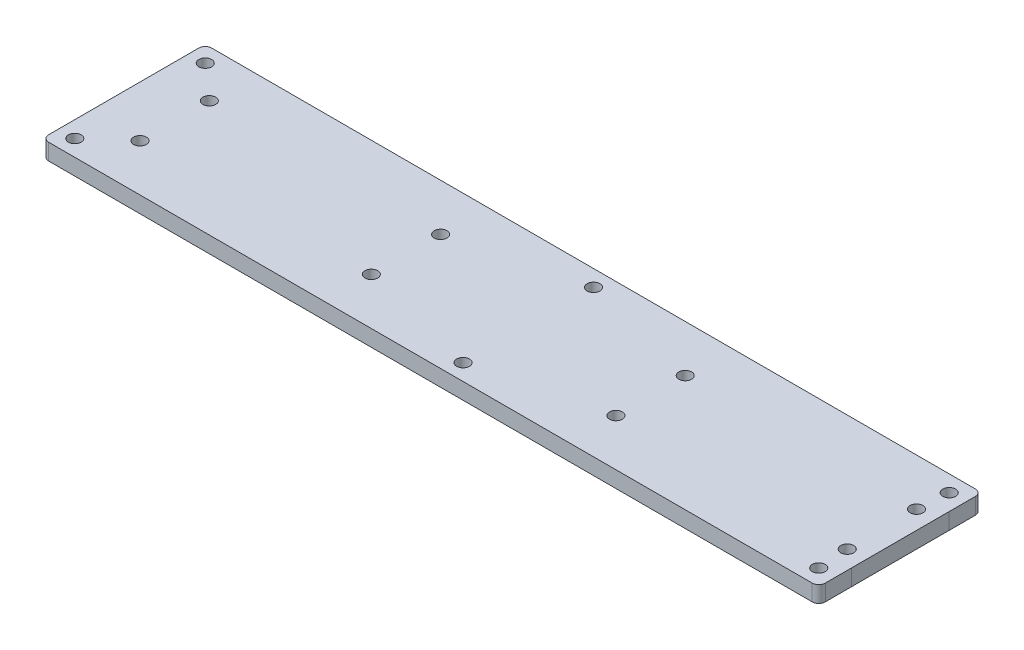
ISO-10303-21;
HEADER;
FILE_DESCRIPTION(('STEP AP214'),'2;1');
FILE_NAME('part.step','',(''),(''),'','','');
FILE_SCHEMA(('AUTOMOTIVE_DESIGN { 1 0 10303 214 1 1 1 1 }'));
ENDSEC;
DATA;
#1=APPLICATION_CONTEXT('core data for automotive mechanical design processes');
#2=APPLICATION_PROTOCOL_DEFINITION('international standard','automotive_design',2000,#1);
#3=PRODUCT_CONTEXT('',#1,'mechanical');
#4=PRODUCT('Part','Part','',(#3));
#5=PRODUCT_RELATED_PRODUCT_CATEGORY('part','',(#4));
#6=PRODUCT_DEFINITION_FORMATION('','',#4);
#7=PRODUCT_DEFINITION_CONTEXT('part definition',#1,'design');
#8=PRODUCT_DEFINITION('design','',#6,#7);
#9=PRODUCT_DEFINITION_SHAPE('','',#8);
#10=(LENGTH_UNIT() NAMED_UNIT(*) SI_UNIT(.MILLI.,.METRE.));
#11=(NAMED_UNIT(*) PLANE_ANGLE_UNIT() SI_UNIT($,.RADIAN.));
#12=(NAMED_UNIT(*) SI_UNIT($,.STERADIAN.) SOLID_ANGLE_UNIT());
#13=UNCERTAINTY_MEASURE_WITH_UNIT(LENGTH_MEASURE(1.E-05),#10,'distance_accuracy_value','');
#14=(GEOMETRIC_REPRESENTATION_CONTEXT(3) GLOBAL_UNCERTAINTY_ASSIGNED_CONTEXT((#13)) GLOBAL_UNIT_ASSIGNED_CONTEXT((#10,
#11,#12)) REPRESENTATION_CONTEXT('',''));
#15=CARTESIAN_POINT('',(0.,0.,0.));
#16=DIRECTION('',(0.,0.,1.));
#17=DIRECTION('',(1.,0.,0.));
#18=AXIS2_PLACEMENT_3D('',#15,#16,#17);
#19=CARTESIAN_POINT('',(0.,6.35,19.05));
#20=DIRECTION('',(0.,0.,-1.));
#21=DIRECTION('',(-1.,0.,0.));
#22=AXIS2_PLACEMENT_3D('',#19,#20,#21);
#23=PLANE('',#22);
#24=DIRECTION('',(0.,1.,0.));
#25=VECTOR('',#24,1.);
#26=CARTESIAN_POINT('',(144.842,-292.181737911527,19.05));
#27=LINE('',#26,#25);
#28=CARTESIAN_POINT('',(144.842,0.,19.05));
#29=VERTEX_POINT('',#28);
#30=CARTESIAN_POINT('',(144.842,6.35,19.05));
#31=VERTEX_POINT('',#30);
#32=EDGE_CURVE('E135',#29,#31,#27,.T.);
#33=ORIENTED_EDGE('',*,*,#32,.T.);
#34=DIRECTION('',(1.,0.,0.));
#35=VECTOR('',#34,1.);
#36=CARTESIAN_POINT('',(0.,6.35,19.05));
#37=LINE('',#36,#35);
#38=CARTESIAN_POINT('',(144.845,6.35,19.05));
#39=VERTEX_POINT('',#38);
#40=EDGE_CURVE('E146',#31,#39,#37,.T.);
#41=ORIENTED_EDGE('',*,*,#40,.T.);
#42=DIRECTION('',(0.,-1.,0.));
#43=VECTOR('',#42,1.);
#44=CARTESIAN_POINT('',(144.845,6.35,19.05));
#45=LINE('',#44,#43);
#46=CARTESIAN_POINT('',(144.845,0.,19.05));
#47=VERTEX_POINT('',#46);
#48=EDGE_CURVE('E199',#39,#47,#45,.T.);
#49=ORIENTED_EDGE('',*,*,#48,.T.);
#50=DIRECTION('',(1.,0.,0.));
#51=VECTOR('',#50,1.);
#52=CARTESIAN_POINT('',(0.,0.,19.05));
#53=LINE('',#52,#51);
#54=EDGE_CURVE('E148',#29,#47,#53,.T.);
#55=ORIENTED_EDGE('',*,*,#54,.F.);
#56=EDGE_LOOP('',(#33,#41,#49,#55));
#57=FACE_BOUND('',#56,.T.);
#58=ADVANCED_FACE('F41',(#57),#23,.T.);
#59=CARTESIAN_POINT('',(0.,6.35,-19.05));
#60=DIRECTION('',(0.,0.,-1.));
#61=DIRECTION('',(-1.,0.,0.));
#62=AXIS2_PLACEMENT_3D('',#59,#60,#61);
#63=PLANE('',#62);
#64=DIRECTION('',(1.,0.,0.));
#65=VECTOR('',#64,1.);
#66=CARTESIAN_POINT('',(0.,6.35,-19.05));
#67=LINE('',#66,#65);
#68=CARTESIAN_POINT('',(144.842,6.35,-19.05));
#69=VERTEX_POINT('',#68);
#70=CARTESIAN_POINT('',(144.845,6.35,-19.05));
#71=VERTEX_POINT('',#70);
#72=EDGE_CURVE('E155',#69,#71,#67,.T.);
#73=ORIENTED_EDGE('',*,*,#72,.F.);
#74=DIRECTION('',(0.,1.,0.));
#75=VECTOR('',#74,1.);
#76=CARTESIAN_POINT('',(144.842,-292.181737911527,-19.05));
#77=LINE('',#76,#75);
#78=CARTESIAN_POINT('',(144.842,0.,-19.05));
#79=VERTEX_POINT('',#78);
#80=EDGE_CURVE('E138',#79,#69,#77,.T.);
#81=ORIENTED_EDGE('',*,*,#80,.F.);
#82=DIRECTION('',(1.,0.,0.));
#83=VECTOR('',#82,1.);
#84=CARTESIAN_POINT('',(0.,0.,-19.05));
#85=LINE('',#84,#83);
#86=CARTESIAN_POINT('',(144.845,0.,-19.05));
#87=VERTEX_POINT('',#86);
#88=EDGE_CURVE('E211',#79,#87,#85,.T.);
#89=ORIENTED_EDGE('',*,*,#88,.T.);
#90=DIRECTION('',(0.,-1.,0.));
#91=VECTOR('',#90,1.);
#92=CARTESIAN_POINT('',(144.845,6.35,-19.05));
#93=LINE('',#92,#91);
#94=EDGE_CURVE('E251',#71,#87,#93,.T.);
#95=ORIENTED_EDGE('',*,*,#94,.F.);
#96=EDGE_LOOP('',(#73,#81,#89,#95));
#97=FACE_BOUND('',#96,.T.);
#98=ADVANCED_FACE('F331',(#97),#63,.F.);
#99=CARTESIAN_POINT('',(144.845,6.35,0.));
#100=DIRECTION('',(-1.,0.,0.));
#101=DIRECTION('',(0.,0.,1.));
#102=AXIS2_PLACEMENT_3D('',#99,#100,#101);
#103=PLANE('',#102);
#104=DIRECTION('',(0.,0.,-1.));
#105=VECTOR('',#104,1.);
#106=CARTESIAN_POINT('',(144.845,0.,0.));
#107=LINE('',#106,#105);
#108=CARTESIAN_POINT('',(144.845,0.,-29.21));
#109=VERTEX_POINT('',#108);
#110=EDGE_CURVE('E214',#87,#109,#107,.T.);
#111=ORIENTED_EDGE('',*,*,#110,.T.);
#112=DIRECTION('',(0.,-1.,0.));
#113=VECTOR('',#112,1.);
#114=CARTESIAN_POINT('',(144.845,6.35,-29.21));
#115=LINE('',#114,#113);
#116=CARTESIAN_POINT('',(144.845,6.35,-29.21));
#117=VERTEX_POINT('',#116);
#118=EDGE_CURVE('E292',#109,#117,#115,.F.);
#119=ORIENTED_EDGE('',*,*,#118,.T.);
#120=DIRECTION('',(0.,0.,-1.));
#121=VECTOR('',#120,1.);
#122=CARTESIAN_POINT('',(144.845,6.35,0.));
#123=LINE('',#122,#121);
#124=EDGE_CURVE('E160',#71,#117,#123,.T.);
#125=ORIENTED_EDGE('',*,*,#124,.F.);
#126=ORIENTED_EDGE('',*,*,#94,.T.);
#127=EDGE_LOOP('',(#111,#119,#125,#126));
#128=FACE_BOUND('',#127,.T.);
#129=ADVANCED_FACE('F336',(#128),#103,.F.);
#130=CARTESIAN_POINT('',(0.,6.35,-31.75));
#131=DIRECTION('',(0.,0.,1.));
#132=DIRECTION('',(1.,0.,0.));
#133=AXIS2_PLACEMENT_3D('',#130,#131,#132);
#134=PLANE('',#133);
#135=DIRECTION('',(-1.,0.,0.));
#136=VECTOR('',#135,1.);
#137=CARTESIAN_POINT('',(0.,0.,-31.75));
#138=LINE('',#137,#136);
#139=CARTESIAN_POINT('',(142.305,0.,-31.75));
#140=VERTEX_POINT('',#139);
#141=CARTESIAN_POINT('',(-155.005,0.,-31.75));
#142=VERTEX_POINT('',#141);
#143=EDGE_CURVE('E218',#140,#142,#138,.T.);
#144=ORIENTED_EDGE('',*,*,#143,.T.);
#145=DIRECTION('',(0.,-1.,0.));
#146=VECTOR('',#145,1.);
#147=CARTESIAN_POINT('',(-155.005,6.35,-31.75));
#148=LINE('',#147,#146);
#149=CARTESIAN_POINT('',(-155.005,6.35,-31.75));
#150=VERTEX_POINT('',#149);
#151=EDGE_CURVE('E278',#142,#150,#148,.F.);
#152=ORIENTED_EDGE('',*,*,#151,.T.);
#153=DIRECTION('',(-1.,0.,0.));
#154=VECTOR('',#153,1.);
#155=CARTESIAN_POINT('',(0.,6.35,-31.75));
#156=LINE('',#155,#154);
#157=CARTESIAN_POINT('',(142.305,6.35,-31.75));
#158=VERTEX_POINT('',#157);
#159=EDGE_CURVE('E170',#158,#150,#156,.T.);
#160=ORIENTED_EDGE('',*,*,#159,.F.);
#161=DIRECTION('',(0.,-1.,0.));
#162=VECTOR('',#161,1.);
#163=CARTESIAN_POINT('',(142.305,6.35,-31.75));
#164=LINE('',#163,#162);
#165=EDGE_CURVE('E274',#158,#140,#164,.T.);
#166=ORIENTED_EDGE('',*,*,#165,.T.);
#167=EDGE_LOOP('',(#144,#152,#160,#166));
#168=FACE_BOUND('',#167,.T.);
#169=ADVANCED_FACE('F370',(#168),#134,.F.);
#170=CARTESIAN_POINT('',(-157.545,6.35,0.));
#171=DIRECTION('',(1.,0.,0.));
#172=DIRECTION('',(0.,0.,-1.));
#173=AXIS2_PLACEMENT_3D('',#170,#171,#172);
#174=PLANE('',#173);
#175=DIRECTION('',(0.,0.,1.));
#176=VECTOR('',#175,1.);
#177=CARTESIAN_POINT('',(-157.545,6.35,0.));
#178=LINE('',#177,#176);
#179=CARTESIAN_POINT('',(-157.545,6.35,-29.21));
#180=VERTEX_POINT('',#179);
#181=CARTESIAN_POINT('',(-157.545,6.35,29.21));
#182=VERTEX_POINT('',#181);
#183=EDGE_CURVE('E174',#180,#182,#178,.T.);
#184=ORIENTED_EDGE('',*,*,#183,.F.);
#185=DIRECTION('',(0.,-1.,0.));
#186=VECTOR('',#185,1.);
#187=CARTESIAN_POINT('',(-157.545,6.35,-29.21));
#188=LINE('',#187,#186);
#189=CARTESIAN_POINT('',(-157.545,0.,-29.21));
#190=VERTEX_POINT('',#189);
#191=EDGE_CURVE('E258',#180,#190,#188,.T.);
#192=ORIENTED_EDGE('',*,*,#191,.T.);
#193=DIRECTION('',(0.,0.,1.));
#194=VECTOR('',#193,1.);
#195=CARTESIAN_POINT('',(-157.545,0.,0.));
#196=LINE('',#195,#194);
#197=CARTESIAN_POINT('',(-157.545,0.,29.21));
#198=VERTEX_POINT('',#197);
#199=EDGE_CURVE('E222',#190,#198,#196,.T.);
#200=ORIENTED_EDGE('',*,*,#199,.T.);
#201=DIRECTION('',(0.,-1.,0.));
#202=VECTOR('',#201,1.);
#203=CARTESIAN_POINT('',(-157.545,6.35,29.21));
#204=LINE('',#203,#202);
#205=EDGE_CURVE('E255',#198,#182,#204,.F.);
#206=ORIENTED_EDGE('',*,*,#205,.T.);
#207=EDGE_LOOP('',(#184,#192,#200,#206));
#208=FACE_BOUND('',#207,.T.);
#209=ADVANCED_FACE('F366',(#208),#174,.F.);
#210=CARTESIAN_POINT('',(0.,6.35,31.75));
#211=DIRECTION('',(0.,0.,-1.));
#212=DIRECTION('',(-1.,0.,0.));
#213=AXIS2_PLACEMENT_3D('',#210,#211,#212);
#214=PLANE('',#213);
#215=DIRECTION('',(1.,0.,0.));
#216=VECTOR('',#215,1.);
#217=CARTESIAN_POINT('',(0.,0.,31.75));
#218=LINE('',#217,#216);
#219=CARTESIAN_POINT('',(-155.005,0.,31.75));
#220=VERTEX_POINT('',#219);
#221=CARTESIAN_POINT('',(142.305,0.,31.75));
#222=VERTEX_POINT('',#221);
#223=EDGE_CURVE('E226',#220,#222,#218,.T.);
#224=ORIENTED_EDGE('',*,*,#223,.T.);
#225=DIRECTION('',(0.,-1.,0.));
#226=VECTOR('',#225,1.);
#227=CARTESIAN_POINT('',(142.305,6.35,31.75));
#228=LINE('',#227,#226);
#229=CARTESIAN_POINT('',(142.305,6.35,31.75));
#230=VERTEX_POINT('',#229);
#231=EDGE_CURVE('E11',#222,#230,#228,.F.);
#232=ORIENTED_EDGE('',*,*,#231,.T.);
#233=DIRECTION('',(1.,0.,0.));
#234=VECTOR('',#233,1.);
#235=CARTESIAN_POINT('',(0.,6.35,31.75));
#236=LINE('',#235,#234);
#237=CARTESIAN_POINT('',(-155.005,6.35,31.75));
#238=VERTEX_POINT('',#237);
#239=EDGE_CURVE('E178',#238,#230,#236,.T.);
#240=ORIENTED_EDGE('',*,*,#239,.F.);
#241=DIRECTION('',(0.,-1.,0.));
#242=VECTOR('',#241,1.);
#243=CARTESIAN_POINT('',(-155.005,6.35,31.75));
#244=LINE('',#243,#242);
#245=EDGE_CURVE('E50',#238,#220,#244,.T.);
#246=ORIENTED_EDGE('',*,*,#245,.T.);
#247=EDGE_LOOP('',(#224,#232,#240,#246));
#248=FACE_BOUND('',#247,.T.);
#249=ADVANCED_FACE('F302',(#248),#214,.F.);
#250=CARTESIAN_POINT('',(138.495,6.35,-25.4));
#251=DIRECTION('',(0.,-1.,0.));
#252=DIRECTION('',(0.,0.,-1.));
#253=AXIS2_PLACEMENT_3D('',#250,#251,#252);
#254=CYLINDRICAL_SURFACE('',#253,2.48999999999998);
#255=CARTESIAN_POINT('',(138.495,6.35,-25.4));
#256=DIRECTION('',(0.,1.,0.));
#257=DIRECTION('',(0.,0.,1.));
#258=AXIS2_PLACEMENT_3D('',#255,#256,#257);
#259=CIRCLE('',#258,2.48999999999998);
#260=CARTESIAN_POINT('',(138.495,6.35,-22.91));
#261=VERTEX_POINT('',#260);
#262=EDGE_CURVE('E191',#261,#261,#259,.T.);
#263=ORIENTED_EDGE('',*,*,#262,.T.);
#264=EDGE_LOOP('',(#263));
#265=FACE_BOUND('',#264,.T.);
#266=CARTESIAN_POINT('',(138.495,0.,-25.4));
#267=DIRECTION('',(0.,1.,0.));
#268=DIRECTION('',(0.,0.,1.));
#269=AXIS2_PLACEMENT_3D('',#266,#267,#268);
#270=CIRCLE('',#269,2.48999999999998);
#271=CARTESIAN_POINT('',(138.495,0.,-22.91));
#272=VERTEX_POINT('',#271);
#273=EDGE_CURVE('E241',#272,#272,#270,.T.);
#274=ORIENTED_EDGE('',*,*,#273,.F.);
#275=EDGE_LOOP('',(#274));
#276=FACE_BOUND('',#275,.T.);
#277=ADVANCED_FACE('F479',(#265,#276),#254,.F.);
#278=CARTESIAN_POINT('',(-151.195,6.35,-25.4));
#279=DIRECTION('',(0.,-1.,0.));
#280=DIRECTION('',(0.,0.,-1.));
#281=AXIS2_PLACEMENT_3D('',#278,#279,#280);
#282=CYLINDRICAL_SURFACE('',#281,2.48999999999998);
#283=CARTESIAN_POINT('',(-151.195,6.35,-25.4));
#284=DIRECTION('',(0.,1.,0.));
#285=DIRECTION('',(0.,0.,1.));
#286=AXIS2_PLACEMENT_3D('',#283,#284,#285);
#287=CIRCLE('',#286,2.48999999999998);
#288=CARTESIAN_POINT('',(-151.195,6.35,-22.91));
#289=VERTEX_POINT('',#288);
#290=EDGE_CURVE('E187',#289,#289,#287,.T.);
#291=ORIENTED_EDGE('',*,*,#290,.T.);
#292=EDGE_LOOP('',(#291));
#293=FACE_BOUND('',#292,.T.);
#294=CARTESIAN_POINT('',(-151.195,0.,-25.4));
#295=DIRECTION('',(0.,1.,0.));
#296=DIRECTION('',(0.,0.,1.));
#297=AXIS2_PLACEMENT_3D('',#294,#295,#296);
#298=CIRCLE('',#297,2.48999999999998);
#299=CARTESIAN_POINT('',(-151.195,0.,-22.91));
#300=VERTEX_POINT('',#299);
#301=EDGE_CURVE('E237',#300,#300,#298,.T.);
#302=ORIENTED_EDGE('',*,*,#301,.F.);
#303=EDGE_LOOP('',(#302));
#304=FACE_BOUND('',#303,.T.);
#305=ADVANCED_FACE('F326',(#293,#304),#282,.F.);
#306=CARTESIAN_POINT('',(-151.195,6.35,25.4));
#307=DIRECTION('',(0.,-1.,0.));
#308=DIRECTION('',(0.,0.,-1.));
#309=AXIS2_PLACEMENT_3D('',#306,#307,#308);
#310=CYLINDRICAL_SURFACE('',#309,2.48999999999998);
#311=CARTESIAN_POINT('',(-151.195,6.35,25.4));
#312=DIRECTION('',(0.,1.,0.));
#313=DIRECTION('',(0.,0.,1.));
#314=AXIS2_PLACEMENT_3D('',#311,#312,#313);
#315=CIRCLE('',#314,2.48999999999998);
#316=CARTESIAN_POINT('',(-151.195,6.35,27.89));
#317=VERTEX_POINT('',#316);
#318=EDGE_CURVE('E183',#317,#317,#315,.T.);
#319=ORIENTED_EDGE('',*,*,#318,.T.);
#320=EDGE_LOOP('',(#319));
#321=FACE_BOUND('',#320,.T.);
#322=CARTESIAN_POINT('',(-151.195,0.,25.4));
#323=DIRECTION('',(0.,1.,0.));
#324=DIRECTION('',(0.,0.,1.));
#325=AXIS2_PLACEMENT_3D('',#322,#323,#324);
#326=CIRCLE('',#325,2.48999999999998);
#327=CARTESIAN_POINT('',(-151.195,0.,27.89));
#328=VERTEX_POINT('',#327);
#329=EDGE_CURVE('E233',#328,#328,#326,.T.);
#330=ORIENTED_EDGE('',*,*,#329,.F.);
#331=EDGE_LOOP('',(#330));
#332=FACE_BOUND('',#331,.T.);
#333=ADVANCED_FACE('F317',(#321,#332),#310,.F.);
#334=CARTESIAN_POINT('',(144.845,6.35,0.));
#335=DIRECTION('',(1.,0.,0.));
#336=DIRECTION('',(0.,0.,-1.));
#337=AXIS2_PLACEMENT_3D('',#334,#335,#336);
#338=PLANE('',#337);
#339=DIRECTION('',(0.,0.,1.));
#340=VECTOR('',#339,1.);
#341=CARTESIAN_POINT('',(144.845,6.35,0.));
#342=LINE('',#341,#340);
#343=CARTESIAN_POINT('',(144.845,6.35,29.21));
#344=VERTEX_POINT('',#343);
#345=EDGE_CURVE('E153',#39,#344,#342,.T.);
#346=ORIENTED_EDGE('',*,*,#345,.T.);
#347=DIRECTION('',(0.,-1.,0.));
#348=VECTOR('',#347,1.);
#349=CARTESIAN_POINT('',(144.845,0.,29.21));
#350=LINE('',#349,#348);
#351=CARTESIAN_POINT('',(144.845,0.,29.21));
#352=VERTEX_POINT('',#351);
#353=EDGE_CURVE('E295',#344,#352,#350,.T.);
#354=ORIENTED_EDGE('',*,*,#353,.T.);
#355=DIRECTION('',(0.,0.,1.));
#356=VECTOR('',#355,1.);
#357=CARTESIAN_POINT('',(144.845,0.,0.));
#358=LINE('',#357,#356);
#359=EDGE_CURVE('E229',#47,#352,#358,.T.);
#360=ORIENTED_EDGE('',*,*,#359,.F.);
#361=ORIENTED_EDGE('',*,*,#48,.F.);
#362=EDGE_LOOP('',(#346,#354,#360,#361));
#363=FACE_BOUND('',#362,.T.);
#364=ADVANCED_FACE('F314',(#363),#338,.T.);
#365=CARTESIAN_POINT('',(0.,6.35,25.4));
#366=DIRECTION('',(0.,-1.,0.));
#367=DIRECTION('',(0.,0.,-1.));
#368=AXIS2_PLACEMENT_3D('',#365,#366,#367);
#369=CYLINDRICAL_SURFACE('',#368,2.48999999999971);
#370=CARTESIAN_POINT('',(0.,6.35,25.4));
#371=DIRECTION('',(0.,1.,0.));
#372=DIRECTION('',(0.,0.,1.));
#373=AXIS2_PLACEMENT_3D('',#370,#371,#372);
#374=CIRCLE('',#373,2.48999999999971);
#375=CARTESIAN_POINT('',(0.,6.35,27.8899999999997));
#376=VERTEX_POINT('',#375);
#377=EDGE_CURVE('E156',#376,#376,#374,.T.);
#378=ORIENTED_EDGE('',*,*,#377,.T.);
#379=EDGE_LOOP('',(#378));
#380=FACE_BOUND('',#379,.T.);
#381=CARTESIAN_POINT('',(0.,0.,25.4));
#382=DIRECTION('',(0.,1.,0.));
#383=DIRECTION('',(0.,0.,1.));
#384=AXIS2_PLACEMENT_3D('',#381,#382,#383);
#385=CIRCLE('',#384,2.48999999999971);
#386=CARTESIAN_POINT('',(0.,0.,27.8899999999997));
#387=VERTEX_POINT('',#386);
#388=EDGE_CURVE('E204',#387,#387,#385,.T.);
#389=ORIENTED_EDGE('',*,*,#388,.F.);
#390=EDGE_LOOP('',(#389));
#391=FACE_BOUND('',#390,.T.);
#392=ADVANCED_FACE('F316',(#380,#391),#369,.F.);
#393=CARTESIAN_POINT('',(138.495,6.35,25.4));
#394=DIRECTION('',(0.,-1.,0.));
#395=DIRECTION('',(0.,0.,-1.));
#396=AXIS2_PLACEMENT_3D('',#393,#394,#395);
#397=CYLINDRICAL_SURFACE('',#396,2.48999999999998);
#398=CARTESIAN_POINT('',(138.495,6.35,25.4));
#399=DIRECTION('',(0.,1.,0.));
#400=DIRECTION('',(0.,0.,1.));
#401=AXIS2_PLACEMENT_3D('',#398,#399,#400);
#402=CIRCLE('',#401,2.48999999999998);
#403=CARTESIAN_POINT('',(138.495,6.35,27.89));
#404=VERTEX_POINT('',#403);
#405=EDGE_CURVE('E163',#404,#404,#402,.T.);
#406=ORIENTED_EDGE('',*,*,#405,.T.);
#407=EDGE_LOOP('',(#406));
#408=FACE_BOUND('',#407,.T.);
#409=CARTESIAN_POINT('',(138.495,0.,25.4));
#410=DIRECTION('',(0.,1.,0.));
#411=DIRECTION('',(0.,0.,1.));
#412=AXIS2_PLACEMENT_3D('',#409,#410,#411);
#413=CIRCLE('',#412,2.48999999999998);
#414=CARTESIAN_POINT('',(138.495,0.,27.89));
#415=VERTEX_POINT('',#414);
#416=EDGE_CURVE('E200',#415,#415,#413,.T.);
#417=ORIENTED_EDGE('',*,*,#416,.F.);
#418=EDGE_LOOP('',(#417));
#419=FACE_BOUND('',#418,.T.);
#420=ADVANCED_FACE('F323',(#408,#419),#397,.F.);
#421=CARTESIAN_POINT('',(0.,6.35,-25.4));
#422=DIRECTION('',(0.,-1.,0.));
#423=DIRECTION('',(0.,0.,-1.));
#424=AXIS2_PLACEMENT_3D('',#421,#422,#423);
#425=CYLINDRICAL_SURFACE('',#424,2.49);
#426=CARTESIAN_POINT('',(0.,6.35,-25.4));
#427=DIRECTION('',(0.,1.,0.));
#428=DIRECTION('',(0.,0.,1.));
#429=AXIS2_PLACEMENT_3D('',#426,#427,#428);
#430=CIRCLE('',#429,2.49);
#431=CARTESIAN_POINT('',(0.,6.35,-22.91));
#432=VERTEX_POINT('',#431);
#433=EDGE_CURVE('E195',#432,#432,#430,.T.);
#434=ORIENTED_EDGE('',*,*,#433,.T.);
#435=EDGE_LOOP('',(#434));
#436=FACE_BOUND('',#435,.T.);
#437=CARTESIAN_POINT('',(0.,0.,-25.4));
#438=DIRECTION('',(0.,1.,0.));
#439=DIRECTION('',(0.,0.,1.));
#440=AXIS2_PLACEMENT_3D('',#437,#438,#439);
#441=CIRCLE('',#440,2.49);
#442=CARTESIAN_POINT('',(0.,0.,-22.91));
#443=VERTEX_POINT('',#442);
#444=EDGE_CURVE('E245',#443,#443,#441,.T.);
#445=ORIENTED_EDGE('',*,*,#444,.F.);
#446=EDGE_LOOP('',(#445));
#447=FACE_BOUND('',#446,.T.);
#448=ADVANCED_FACE('F343',(#436,#447),#425,.F.);
#449=CARTESIAN_POINT('',(0.,6.35,0.));
#450=DIRECTION('',(0.,1.,0.));
#451=DIRECTION('',(0.,0.,1.));
#452=AXIS2_PLACEMENT_3D('',#449,#450,#451);
#453=PLANE('',#452);
#454=ORIENTED_EDGE('',*,*,#40,.F.);
#455=DIRECTION('',(0.,0.,-1.));
#456=VECTOR('',#455,1.);
#457=CARTESIAN_POINT('',(144.842,6.35,19.05));
#458=LINE('',#457,#456);
#459=EDGE_CURVE('E132',#31,#69,#458,.T.);
#460=ORIENTED_EDGE('',*,*,#459,.T.);
#461=ORIENTED_EDGE('',*,*,#72,.T.);
#462=ORIENTED_EDGE('',*,*,#124,.T.);
#463=CARTESIAN_POINT('',(142.305,6.35,-29.21));
#464=DIRECTION('',(0.,1.,0.));
#465=DIRECTION('',(0.,0.,1.));
#466=AXIS2_PLACEMENT_3D('',#463,#464,#465);
#467=CIRCLE('',#466,2.54);
#468=EDGE_CURVE('E286',#117,#158,#467,.T.);
#469=ORIENTED_EDGE('',*,*,#468,.T.);
#470=ORIENTED_EDGE('',*,*,#159,.T.);
#471=CARTESIAN_POINT('',(-155.005,6.35,-29.21));
#472=DIRECTION('',(0.,1.,0.));
#473=DIRECTION('',(0.,0.,1.));
#474=AXIS2_PLACEMENT_3D('',#471,#472,#473);
#475=CIRCLE('',#474,2.54);
#476=EDGE_CURVE('E289',#150,#180,#475,.T.);
#477=ORIENTED_EDGE('',*,*,#476,.T.);
#478=ORIENTED_EDGE('',*,*,#183,.T.);
#479=CARTESIAN_POINT('',(-155.005,6.35,29.21));
#480=DIRECTION('',(0.,1.,0.));
#481=DIRECTION('',(0.,0.,1.));
#482=AXIS2_PLACEMENT_3D('',#479,#480,#481);
#483=CIRCLE('',#482,2.54);
#484=EDGE_CURVE('E281',#182,#238,#483,.T.);
#485=ORIENTED_EDGE('',*,*,#484,.T.);
#486=ORIENTED_EDGE('',*,*,#239,.T.);
#487=CARTESIAN_POINT('',(142.305,6.35,29.21));
#488=DIRECTION('',(0.,1.,0.));
#489=DIRECTION('',(0.,0.,1.));
#490=AXIS2_PLACEMENT_3D('',#487,#488,#489);
#491=CIRCLE('',#490,2.54);
#492=EDGE_CURVE('E57',#230,#344,#491,.T.);
#493=ORIENTED_EDGE('',*,*,#492,.T.);
#494=ORIENTED_EDGE('',*,*,#345,.F.);
#495=EDGE_LOOP('',(#454,#460,#461,#462,#469,#470,#477,#478,#485,#486,#493,#494));
#496=FACE_BOUND('',#495,.T.);
#497=ORIENTED_EDGE('',*,*,#405,.F.);
#498=EDGE_LOOP('',(#497));
#499=FACE_BOUND('',#498,.T.);
#500=ORIENTED_EDGE('',*,*,#377,.F.);
#501=EDGE_LOOP('',(#500));
#502=FACE_BOUND('',#501,.T.);
#503=ORIENTED_EDGE('',*,*,#318,.F.);
#504=EDGE_LOOP('',(#503));
#505=FACE_BOUND('',#504,.T.);
#506=ORIENTED_EDGE('',*,*,#290,.F.);
#507=EDGE_LOOP('',(#506));
#508=FACE_BOUND('',#507,.T.);
#509=ORIENTED_EDGE('',*,*,#262,.F.);
#510=EDGE_LOOP('',(#509));
#511=FACE_BOUND('',#510,.T.);
#512=ORIENTED_EDGE('',*,*,#433,.F.);
#513=EDGE_LOOP('',(#512));
#514=FACE_BOUND('',#513,.T.);
#515=CARTESIAN_POINT('',(137.6792,6.35,13.4874));
#516=DIRECTION('',(0.,1.,0.));
#517=DIRECTION('',(0.,0.,1.));
#518=AXIS2_PLACEMENT_3D('',#515,#516,#517);
#519=CIRCLE('',#518,2.4892);
#520=CARTESIAN_POINT('',(137.6792,6.35,15.9766));
#521=VERTEX_POINT('',#520);
#522=EDGE_CURVE('E392',#521,#521,#519,.T.);
#523=ORIENTED_EDGE('',*,*,#522,.F.);
#524=EDGE_LOOP('',(#523));
#525=FACE_BOUND('',#524,.T.);
#526=CARTESIAN_POINT('',(137.6792,6.35,-13.4874));
#527=DIRECTION('',(0.,1.,0.));
#528=DIRECTION('',(0.,0.,1.));
#529=AXIS2_PLACEMENT_3D('',#526,#527,#528);
#530=CIRCLE('',#529,2.4892);
#531=CARTESIAN_POINT('',(137.6792,6.35,-10.9982));
#532=VERTEX_POINT('',#531);
#533=EDGE_CURVE('E396',#532,#532,#530,.T.);
#534=ORIENTED_EDGE('',*,*,#533,.F.);
#535=EDGE_LOOP('',(#534));
#536=FACE_BOUND('',#535,.T.);
#537=CARTESIAN_POINT('',(47.6107999999999,6.35,13.4874));
#538=DIRECTION('',(0.,1.,0.));
#539=DIRECTION('',(0.,0.,1.));
#540=AXIS2_PLACEMENT_3D('',#537,#538,#539);
#541=CIRCLE('',#540,2.4892);
#542=CARTESIAN_POINT('',(47.6107999999999,6.35,15.9766));
#543=VERTEX_POINT('',#542);
#544=EDGE_CURVE('E400',#543,#543,#541,.T.);
#545=ORIENTED_EDGE('',*,*,#544,.F.);
#546=EDGE_LOOP('',(#545));
#547=FACE_BOUND('',#546,.T.);
#548=CARTESIAN_POINT('',(47.6107999999999,6.35,-13.4874));
#549=DIRECTION('',(0.,1.,0.));
#550=DIRECTION('',(0.,0.,1.));
#551=AXIS2_PLACEMENT_3D('',#548,#549,#550);
#552=CIRCLE('',#551,2.4892);
#553=CARTESIAN_POINT('',(47.6107999999999,6.35,-10.9982));
#554=VERTEX_POINT('',#553);
#555=EDGE_CURVE('E404',#554,#554,#552,.T.);
#556=ORIENTED_EDGE('',*,*,#555,.F.);
#557=EDGE_LOOP('',(#556));
#558=FACE_BOUND('',#557,.T.);
#559=CARTESIAN_POINT('',(-47.6392000000001,6.35,-13.4874));
#560=DIRECTION('',(0.,1.,0.));
#561=DIRECTION('',(0.,0.,1.));
#562=AXIS2_PLACEMENT_3D('',#559,#560,#561);
#563=CIRCLE('',#562,2.4892);
#564=CARTESIAN_POINT('',(-47.6392000000001,6.35,-10.9982));
#565=VERTEX_POINT('',#564);
#566=EDGE_CURVE('E408',#565,#565,#563,.T.);
#567=ORIENTED_EDGE('',*,*,#566,.F.);
#568=EDGE_LOOP('',(#567));
#569=FACE_BOUND('',#568,.T.);
#570=CARTESIAN_POINT('',(-47.6392000000001,6.35,13.4874));
#571=DIRECTION('',(0.,1.,0.));
#572=DIRECTION('',(0.,0.,1.));
#573=AXIS2_PLACEMENT_3D('',#570,#571,#572);
#574=CIRCLE('',#573,2.4892);
#575=CARTESIAN_POINT('',(-47.6392000000001,6.35,15.9766));
#576=VERTEX_POINT('',#575);
#577=EDGE_CURVE('E412',#576,#576,#574,.T.);
#578=ORIENTED_EDGE('',*,*,#577,.F.);
#579=EDGE_LOOP('',(#578));
#580=FACE_BOUND('',#579,.T.);
#581=CARTESIAN_POINT('',(-137.733,6.35,13.4874));
#582=DIRECTION('',(0.,1.,0.));
#583=DIRECTION('',(0.,0.,1.));
#584=AXIS2_PLACEMENT_3D('',#581,#582,#583);
#585=CIRCLE('',#584,2.4892);
#586=CARTESIAN_POINT('',(-137.733,6.35,15.9766));
#587=VERTEX_POINT('',#586);
#588=EDGE_CURVE('E416',#587,#587,#585,.T.);
#589=ORIENTED_EDGE('',*,*,#588,.F.);
#590=EDGE_LOOP('',(#589));
#591=FACE_BOUND('',#590,.T.);
#592=CARTESIAN_POINT('',(-137.7076,6.35,-13.4874));
#593=DIRECTION('',(0.,1.,0.));
#594=DIRECTION('',(0.,0.,1.));
#595=AXIS2_PLACEMENT_3D('',#592,#593,#594);
#596=CIRCLE('',#595,2.4892);
#597=CARTESIAN_POINT('',(-137.7076,6.35,-10.9982));
#598=VERTEX_POINT('',#597);
#599=EDGE_CURVE('E142',#598,#598,#596,.T.);
#600=ORIENTED_EDGE('',*,*,#599,.F.);
#601=EDGE_LOOP('',(#600));
#602=FACE_BOUND('',#601,.T.);
#603=ADVANCED_FACE('F151',(#496,#499,#502,#505,#508,#511,#514,#525,#536,#547,#558,#569,#580,
#591,#602),#453,.T.);
#604=CARTESIAN_POINT('',(0.,0.,0.));
#605=DIRECTION('',(0.,1.,0.));
#606=DIRECTION('',(0.,0.,1.));
#607=AXIS2_PLACEMENT_3D('',#604,#605,#606);
#608=PLANE('',#607);
#609=DIRECTION('',(0.,0.,1.));
#610=VECTOR('',#609,1.);
#611=CARTESIAN_POINT('',(144.842,0.,19.05));
#612=LINE('',#611,#610);
#613=EDGE_CURVE('E380',#79,#29,#612,.T.);
#614=ORIENTED_EDGE('',*,*,#613,.T.);
#615=ORIENTED_EDGE('',*,*,#54,.T.);
#616=ORIENTED_EDGE('',*,*,#359,.T.);
#617=CARTESIAN_POINT('',(142.305,0.,29.21));
#618=DIRECTION('',(0.,1.,0.));
#619=DIRECTION('',(0.,0.,1.));
#620=AXIS2_PLACEMENT_3D('',#617,#618,#619);
#621=CIRCLE('',#620,2.54);
#622=EDGE_CURVE('E265',#352,#222,#621,.F.);
#623=ORIENTED_EDGE('',*,*,#622,.T.);
#624=ORIENTED_EDGE('',*,*,#223,.F.);
#625=CARTESIAN_POINT('',(-155.005,0.,29.21));
#626=DIRECTION('',(0.,1.,0.));
#627=DIRECTION('',(0.,0.,1.));
#628=AXIS2_PLACEMENT_3D('',#625,#626,#627);
#629=CIRCLE('',#628,2.54);
#630=EDGE_CURVE('E262',#220,#198,#629,.F.);
#631=ORIENTED_EDGE('',*,*,#630,.T.);
#632=ORIENTED_EDGE('',*,*,#199,.F.);
#633=CARTESIAN_POINT('',(-155.005,0.,-29.21));
#634=DIRECTION('',(0.,1.,0.));
#635=DIRECTION('',(0.,0.,1.));
#636=AXIS2_PLACEMENT_3D('',#633,#634,#635);
#637=CIRCLE('',#636,2.54);
#638=EDGE_CURVE('E271',#190,#142,#637,.F.);
#639=ORIENTED_EDGE('',*,*,#638,.T.);
#640=ORIENTED_EDGE('',*,*,#143,.F.);
#641=CARTESIAN_POINT('',(142.305,0.,-29.21));
#642=DIRECTION('',(0.,1.,0.));
#643=DIRECTION('',(0.,0.,1.));
#644=AXIS2_PLACEMENT_3D('',#641,#642,#643);
#645=CIRCLE('',#644,2.54);
#646=EDGE_CURVE('E268',#140,#109,#645,.F.);
#647=ORIENTED_EDGE('',*,*,#646,.T.);
#648=ORIENTED_EDGE('',*,*,#110,.F.);
#649=ORIENTED_EDGE('',*,*,#88,.F.);
#650=EDGE_LOOP('',(#614,#615,#616,#623,#624,#631,#632,#639,#640,#647,#648,#649));
#651=FACE_BOUND('',#650,.T.);
#652=ORIENTED_EDGE('',*,*,#416,.T.);
#653=EDGE_LOOP('',(#652));
#654=FACE_BOUND('',#653,.T.);
#655=ORIENTED_EDGE('',*,*,#388,.T.);
#656=EDGE_LOOP('',(#655));
#657=FACE_BOUND('',#656,.T.);
#658=ORIENTED_EDGE('',*,*,#329,.T.);
#659=EDGE_LOOP('',(#658));
#660=FACE_BOUND('',#659,.T.);
#661=ORIENTED_EDGE('',*,*,#301,.T.);
#662=EDGE_LOOP('',(#661));
#663=FACE_BOUND('',#662,.T.);
#664=ORIENTED_EDGE('',*,*,#273,.T.);
#665=EDGE_LOOP('',(#664));
#666=FACE_BOUND('',#665,.T.);
#667=ORIENTED_EDGE('',*,*,#444,.T.);
#668=EDGE_LOOP('',(#667));
#669=FACE_BOUND('',#668,.T.);
#670=CARTESIAN_POINT('',(-137.733,0.,13.4874));
#671=DIRECTION('',(0.,1.,0.));
#672=DIRECTION('',(0.,0.,1.));
#673=AXIS2_PLACEMENT_3D('',#670,#671,#672);
#674=CIRCLE('',#673,2.4892);
#675=CARTESIAN_POINT('',(-137.733,0.,15.9766));
#676=VERTEX_POINT('',#675);
#677=EDGE_CURVE('E382',#676,#676,#674,.F.);
#678=ORIENTED_EDGE('',*,*,#677,.F.);
#679=EDGE_LOOP('',(#678));
#680=FACE_BOUND('',#679,.T.);
#681=CARTESIAN_POINT('',(-47.6392000000001,0.,-13.4874));
#682=DIRECTION('',(0.,1.,0.));
#683=DIRECTION('',(0.,0.,1.));
#684=AXIS2_PLACEMENT_3D('',#681,#682,#683);
#685=CIRCLE('',#684,2.4892);
#686=CARTESIAN_POINT('',(-47.6392000000001,0.,-10.9982));
#687=VERTEX_POINT('',#686);
#688=EDGE_CURVE('E387',#687,#687,#685,.F.);
#689=ORIENTED_EDGE('',*,*,#688,.F.);
#690=EDGE_LOOP('',(#689));
#691=FACE_BOUND('',#690,.T.);
#692=CARTESIAN_POINT('',(47.6107999999999,0.,13.4874));
#693=DIRECTION('',(0.,1.,0.));
#694=DIRECTION('',(0.,0.,1.));
#695=AXIS2_PLACEMENT_3D('',#692,#693,#694);
#696=CIRCLE('',#695,2.4892);
#697=CARTESIAN_POINT('',(47.6107999999999,0.,15.9766));
#698=VERTEX_POINT('',#697);
#699=EDGE_CURVE('E427',#698,#698,#696,.F.);
#700=ORIENTED_EDGE('',*,*,#699,.F.);
#701=EDGE_LOOP('',(#700));
#702=FACE_BOUND('',#701,.T.);
#703=CARTESIAN_POINT('',(137.6792,0.,13.4874));
#704=DIRECTION('',(0.,1.,0.));
#705=DIRECTION('',(0.,0.,1.));
#706=AXIS2_PLACEMENT_3D('',#703,#704,#705);
#707=CIRCLE('',#706,2.4892);
#708=CARTESIAN_POINT('',(137.6792,0.,15.9766));
#709=VERTEX_POINT('',#708);
#710=EDGE_CURVE('E423',#709,#709,#707,.F.);
#711=ORIENTED_EDGE('',*,*,#710,.F.);
#712=EDGE_LOOP('',(#711));
#713=FACE_BOUND('',#712,.T.);
#714=CARTESIAN_POINT('',(137.6792,0.,-13.4874));
#715=DIRECTION('',(0.,1.,0.));
#716=DIRECTION('',(0.,0.,1.));
#717=AXIS2_PLACEMENT_3D('',#714,#715,#716);
#718=CIRCLE('',#717,2.4892);
#719=CARTESIAN_POINT('',(137.6792,0.,-10.9982));
#720=VERTEX_POINT('',#719);
#721=EDGE_CURVE('E426',#720,#720,#718,.F.);
#722=ORIENTED_EDGE('',*,*,#721,.F.);
#723=EDGE_LOOP('',(#722));
#724=FACE_BOUND('',#723,.T.);
#725=CARTESIAN_POINT('',(47.6107999999999,0.,-13.4874));
#726=DIRECTION('',(0.,1.,0.));
#727=DIRECTION('',(0.,0.,1.));
#728=AXIS2_PLACEMENT_3D('',#725,#726,#727);
#729=CIRCLE('',#728,2.4892);
#730=CARTESIAN_POINT('',(47.6107999999999,0.,-10.9982));
#731=VERTEX_POINT('',#730);
#732=EDGE_CURVE('E511',#731,#731,#729,.F.);
#733=ORIENTED_EDGE('',*,*,#732,.F.);
#734=EDGE_LOOP('',(#733));
#735=FACE_BOUND('',#734,.T.);
#736=CARTESIAN_POINT('',(-47.6392000000001,0.,13.4874));
#737=DIRECTION('',(0.,1.,0.));
#738=DIRECTION('',(0.,0.,1.));
#739=AXIS2_PLACEMENT_3D('',#736,#737,#738);
#740=CIRCLE('',#739,2.4892);
#741=CARTESIAN_POINT('',(-47.6392000000001,0.,15.9766));
#742=VERTEX_POINT('',#741);
#743=EDGE_CURVE('E515',#742,#742,#740,.F.);
#744=ORIENTED_EDGE('',*,*,#743,.F.);
#745=EDGE_LOOP('',(#744));
#746=FACE_BOUND('',#745,.T.);
#747=CARTESIAN_POINT('',(-137.7076,0.,-13.4874));
#748=DIRECTION('',(0.,1.,0.));
#749=DIRECTION('',(0.,0.,1.));
#750=AXIS2_PLACEMENT_3D('',#747,#748,#749);
#751=CIRCLE('',#750,2.4892);
#752=CARTESIAN_POINT('',(-137.7076,0.,-10.9982));
#753=VERTEX_POINT('',#752);
#754=EDGE_CURVE('E205',#753,#753,#751,.F.);
#755=ORIENTED_EDGE('',*,*,#754,.F.);
#756=EDGE_LOOP('',(#755));
#757=FACE_BOUND('',#756,.T.);
#758=ADVANCED_FACE('F306',(#651,#654,#657,#660,#663,#666,#669,#680,#691,#702,#713,#724,#735,
#746,#757),#608,.F.);
#759=CARTESIAN_POINT('',(-155.005,6.35,-29.21));
#760=DIRECTION('',(0.,-1.,0.));
#761=DIRECTION('',(0.,0.,-1.));
#762=AXIS2_PLACEMENT_3D('',#759,#760,#761);
#763=CYLINDRICAL_SURFACE('',#762,2.54);
#764=ORIENTED_EDGE('',*,*,#476,.F.);
#765=ORIENTED_EDGE('',*,*,#151,.F.);
#766=ORIENTED_EDGE('',*,*,#638,.F.);
#767=ORIENTED_EDGE('',*,*,#191,.F.);
#768=EDGE_LOOP('',(#764,#765,#766,#767));
#769=FACE_BOUND('',#768,.T.);
#770=ADVANCED_FACE('F345',(#769),#763,.T.);
#771=CARTESIAN_POINT('',(142.305,6.35,-29.21));
#772=DIRECTION('',(0.,-1.,0.));
#773=DIRECTION('',(0.,0.,-1.));
#774=AXIS2_PLACEMENT_3D('',#771,#772,#773);
#775=CYLINDRICAL_SURFACE('',#774,2.54);
#776=ORIENTED_EDGE('',*,*,#468,.F.);
#777=ORIENTED_EDGE('',*,*,#118,.F.);
#778=ORIENTED_EDGE('',*,*,#646,.F.);
#779=ORIENTED_EDGE('',*,*,#165,.F.);
#780=EDGE_LOOP('',(#776,#777,#778,#779));
#781=FACE_BOUND('',#780,.T.);
#782=ADVANCED_FACE('F348',(#781),#775,.T.);
#783=CARTESIAN_POINT('',(142.305,6.35,29.21));
#784=DIRECTION('',(0.,1.,0.));
#785=DIRECTION('',(0.,0.,1.));
#786=AXIS2_PLACEMENT_3D('',#783,#784,#785);
#787=CYLINDRICAL_SURFACE('',#786,2.54);
#788=ORIENTED_EDGE('',*,*,#492,.F.);
#789=ORIENTED_EDGE('',*,*,#231,.F.);
#790=ORIENTED_EDGE('',*,*,#622,.F.);
#791=ORIENTED_EDGE('',*,*,#353,.F.);
#792=EDGE_LOOP('',(#788,#789,#790,#791));
#793=FACE_BOUND('',#792,.T.);
#794=ADVANCED_FACE('F312',(#793),#787,.T.);
#795=CARTESIAN_POINT('',(-155.005,6.35,29.21));
#796=DIRECTION('',(0.,-1.,0.));
#797=DIRECTION('',(0.,0.,-1.));
#798=AXIS2_PLACEMENT_3D('',#795,#796,#797);
#799=CYLINDRICAL_SURFACE('',#798,2.54);
#800=ORIENTED_EDGE('',*,*,#484,.F.);
#801=ORIENTED_EDGE('',*,*,#205,.F.);
#802=ORIENTED_EDGE('',*,*,#630,.F.);
#803=ORIENTED_EDGE('',*,*,#245,.F.);
#804=EDGE_LOOP('',(#800,#801,#802,#803));
#805=FACE_BOUND('',#804,.T.);
#806=ADVANCED_FACE('F43',(#805),#799,.T.);
#807=CARTESIAN_POINT('',(144.842,-292.181737911527,19.05));
#808=DIRECTION('',(1.,0.,0.));
#809=DIRECTION('',(0.,0.,-1.));
#810=AXIS2_PLACEMENT_3D('',#807,#808,#809);
#811=PLANE('',#810);
#812=ORIENTED_EDGE('',*,*,#613,.F.);
#813=ORIENTED_EDGE('',*,*,#80,.T.);
#814=ORIENTED_EDGE('',*,*,#459,.F.);
#815=ORIENTED_EDGE('',*,*,#32,.F.);
#816=EDGE_LOOP('',(#812,#813,#814,#815));
#817=FACE_BOUND('',#816,.T.);
#818=ADVANCED_FACE('F134',(#817),#811,.T.);
#819=CARTESIAN_POINT('',(-137.7076,-292.181737911527,-13.4874));
#820=DIRECTION('',(0.,1.,0.));
#821=DIRECTION('',(0.,0.,1.));
#822=AXIS2_PLACEMENT_3D('',#819,#820,#821);
#823=CYLINDRICAL_SURFACE('',#822,2.4892);
#824=ORIENTED_EDGE('',*,*,#754,.T.);
#825=EDGE_LOOP('',(#824));
#826=FACE_BOUND('',#825,.T.);
#827=ORIENTED_EDGE('',*,*,#599,.T.);
#828=EDGE_LOOP('',(#827));
#829=FACE_BOUND('',#828,.T.);
#830=ADVANCED_FACE('F359',(#826,#829),#823,.F.);
#831=CARTESIAN_POINT('',(-137.733,-292.181737911527,13.4874));
#832=DIRECTION('',(0.,1.,0.));
#833=DIRECTION('',(0.,0.,1.));
#834=AXIS2_PLACEMENT_3D('',#831,#832,#833);
#835=CYLINDRICAL_SURFACE('',#834,2.4892);
#836=ORIENTED_EDGE('',*,*,#677,.T.);
#837=EDGE_LOOP('',(#836));
#838=FACE_BOUND('',#837,.T.);
#839=ORIENTED_EDGE('',*,*,#588,.T.);
#840=EDGE_LOOP('',(#839));
#841=FACE_BOUND('',#840,.T.);
#842=ADVANCED_FACE('F462',(#838,#841),#835,.F.);
#843=CARTESIAN_POINT('',(-47.6392000000001,-292.181737911527,13.4874));
#844=DIRECTION('',(0.,1.,0.));
#845=DIRECTION('',(0.,0.,1.));
#846=AXIS2_PLACEMENT_3D('',#843,#844,#845);
#847=CYLINDRICAL_SURFACE('',#846,2.4892);
#848=ORIENTED_EDGE('',*,*,#743,.T.);
#849=EDGE_LOOP('',(#848));
#850=FACE_BOUND('',#849,.T.);
#851=ORIENTED_EDGE('',*,*,#577,.T.);
#852=EDGE_LOOP('',(#851));
#853=FACE_BOUND('',#852,.T.);
#854=ADVANCED_FACE('F468',(#850,#853),#847,.F.);
#855=CARTESIAN_POINT('',(-47.6392000000001,-292.181737911527,-13.4874));
#856=DIRECTION('',(0.,1.,0.));
#857=DIRECTION('',(0.,0.,1.));
#858=AXIS2_PLACEMENT_3D('',#855,#856,#857);
#859=CYLINDRICAL_SURFACE('',#858,2.4892);
#860=ORIENTED_EDGE('',*,*,#688,.T.);
#861=EDGE_LOOP('',(#860));
#862=FACE_BOUND('',#861,.T.);
#863=ORIENTED_EDGE('',*,*,#566,.T.);
#864=EDGE_LOOP('',(#863));
#865=FACE_BOUND('',#864,.T.);
#866=ADVANCED_FACE('F548',(#862,#865),#859,.F.);
#867=CARTESIAN_POINT('',(47.6107999999999,-292.181737911527,-13.4874));
#868=DIRECTION('',(0.,1.,0.));
#869=DIRECTION('',(0.,0.,1.));
#870=AXIS2_PLACEMENT_3D('',#867,#868,#869);
#871=CYLINDRICAL_SURFACE('',#870,2.4892);
#872=ORIENTED_EDGE('',*,*,#732,.T.);
#873=EDGE_LOOP('',(#872));
#874=FACE_BOUND('',#873,.T.);
#875=ORIENTED_EDGE('',*,*,#555,.T.);
#876=EDGE_LOOP('',(#875));
#877=FACE_BOUND('',#876,.T.);
#878=ADVANCED_FACE('F542',(#874,#877),#871,.F.);
#879=CARTESIAN_POINT('',(47.6107999999999,-292.181737911527,13.4874));
#880=DIRECTION('',(0.,1.,0.));
#881=DIRECTION('',(0.,0.,1.));
#882=AXIS2_PLACEMENT_3D('',#879,#880,#881);
#883=CYLINDRICAL_SURFACE('',#882,2.4892);
#884=ORIENTED_EDGE('',*,*,#699,.T.);
#885=EDGE_LOOP('',(#884));
#886=FACE_BOUND('',#885,.T.);
#887=ORIENTED_EDGE('',*,*,#544,.T.);
#888=EDGE_LOOP('',(#887));
#889=FACE_BOUND('',#888,.T.);
#890=ADVANCED_FACE('F534',(#886,#889),#883,.F.);
#891=CARTESIAN_POINT('',(137.6792,-292.181737911527,-13.4874));
#892=DIRECTION('',(0.,1.,0.));
#893=DIRECTION('',(0.,0.,1.));
#894=AXIS2_PLACEMENT_3D('',#891,#892,#893);
#895=CYLINDRICAL_SURFACE('',#894,2.4892);
#896=ORIENTED_EDGE('',*,*,#721,.T.);
#897=EDGE_LOOP('',(#896));
#898=FACE_BOUND('',#897,.T.);
#899=ORIENTED_EDGE('',*,*,#533,.T.);
#900=EDGE_LOOP('',(#899));
#901=FACE_BOUND('',#900,.T.);
#902=ADVANCED_FACE('F530',(#898,#901),#895,.F.);
#903=CARTESIAN_POINT('',(137.6792,-292.181737911527,13.4874));
#904=DIRECTION('',(0.,1.,0.));
#905=DIRECTION('',(0.,0.,1.));
#906=AXIS2_PLACEMENT_3D('',#903,#904,#905);
#907=CYLINDRICAL_SURFACE('',#906,2.4892);
#908=ORIENTED_EDGE('',*,*,#710,.T.);
#909=EDGE_LOOP('',(#908));
#910=FACE_BOUND('',#909,.T.);
#911=ORIENTED_EDGE('',*,*,#522,.T.);
#912=EDGE_LOOP('',(#911));
#913=FACE_BOUND('',#912,.T.);
#914=ADVANCED_FACE('F533',(#910,#913),#907,.F.);
#915=CLOSED_SHELL('',(#58,#98,#129,#169,#209,#249,#277,#305,#333,#364,#392,#420,#448,#603,#758,
#770,#782,#794,#806,#818,#830,#842,#854,#866,#878,#890,#902,#914));
#916=MANIFOLD_SOLID_BREP('B2',#915);
#917=ADVANCED_BREP_SHAPE_REPRESENTATION('',(#18,#916),#14);
#918=SHAPE_DEFINITION_REPRESENTATION(#9,#917);
ENDSEC;
END-ISO-10303-21;
